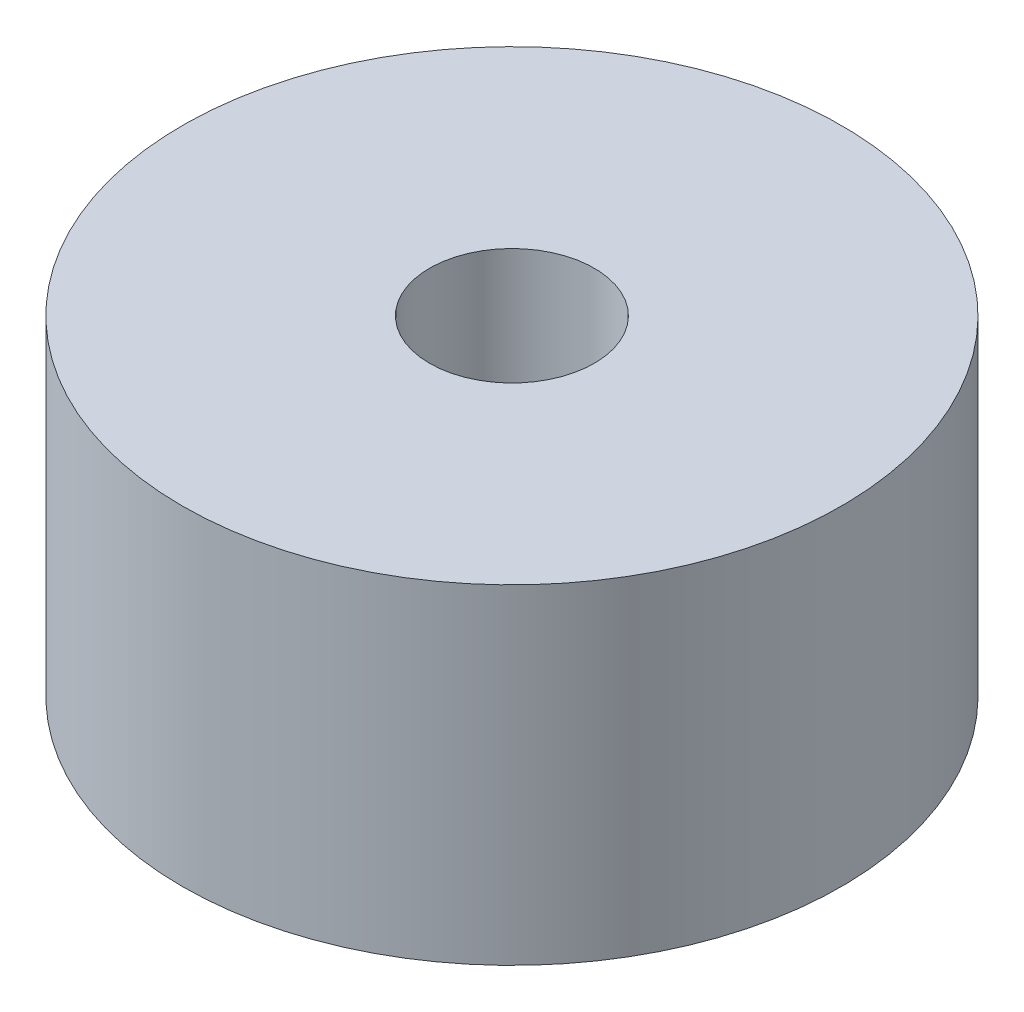
ISO-10303-21;
HEADER;
FILE_DESCRIPTION(('STEP AP214'),'2;1');
FILE_NAME('part.step','',(''),(''),'','','');
FILE_SCHEMA(('AUTOMOTIVE_DESIGN { 1 0 10303 214 1 1 1 1 }'));
ENDSEC;
DATA;
#1=APPLICATION_CONTEXT('core data for automotive mechanical design processes');
#2=APPLICATION_PROTOCOL_DEFINITION('international standard','automotive_design',2000,#1);
#3=PRODUCT_CONTEXT('',#1,'mechanical');
#4=PRODUCT('Part','Part','',(#3));
#5=PRODUCT_RELATED_PRODUCT_CATEGORY('part','',(#4));
#6=PRODUCT_DEFINITION_FORMATION('','',#4);
#7=PRODUCT_DEFINITION_CONTEXT('part definition',#1,'design');
#8=PRODUCT_DEFINITION('design','',#6,#7);
#9=PRODUCT_DEFINITION_SHAPE('','',#8);
#10=(LENGTH_UNIT() NAMED_UNIT(*) SI_UNIT(.MILLI.,.METRE.));
#11=(NAMED_UNIT(*) PLANE_ANGLE_UNIT() SI_UNIT($,.RADIAN.));
#12=(NAMED_UNIT(*) SI_UNIT($,.STERADIAN.) SOLID_ANGLE_UNIT());
#13=UNCERTAINTY_MEASURE_WITH_UNIT(LENGTH_MEASURE(1.E-05),#10,'distance_accuracy_value','');
#14=(GEOMETRIC_REPRESENTATION_CONTEXT(3) GLOBAL_UNCERTAINTY_ASSIGNED_CONTEXT((#13)) GLOBAL_UNIT_ASSIGNED_CONTEXT((#10,
#11,#12)) REPRESENTATION_CONTEXT('',''));
#15=CARTESIAN_POINT('',(0.,0.,0.));
#16=DIRECTION('',(0.,0.,1.));
#17=DIRECTION('',(1.,0.,0.));
#18=AXIS2_PLACEMENT_3D('',#15,#16,#17);
#19=CARTESIAN_POINT('',(0.,6.35,44.45));
#20=DIRECTION('',(0.,-1.,0.));
#21=DIRECTION('',(0.,0.,-1.));
#22=AXIS2_PLACEMENT_3D('',#19,#20,#21);
#23=CYLINDRICAL_SURFACE('',#22,3.175);
#24=DIRECTION('',(0.,1.,0.));
#25=VECTOR('',#24,1.);
#26=CARTESIAN_POINT('',(6.5404174179879E-13,3.81,47.625));
#27=LINE('',#26,#25);
#28=CARTESIAN_POINT('',(6.5404174179879E-13,3.81,47.625));
#29=VERTEX_POINT('',#28);
#30=CARTESIAN_POINT('',(6.5404174179879E-13,6.35,47.625));
#31=VERTEX_POINT('',#30);
#32=EDGE_CURVE('E313',#29,#31,#27,.T.);
#33=ORIENTED_EDGE('',*,*,#32,.F.);
#34=CARTESIAN_POINT('',(6.20785382046309E-13,3.81,44.45));
#35=DIRECTION('',(0.,1.,0.));
#36=DIRECTION('',(1.,0.,0.));
#37=AXIS2_PLACEMENT_3D('',#34,#35,#36);
#38=CIRCLE('',#37,3.175);
#39=CARTESIAN_POINT('',(2.90993556629759,3.81,45.72));
#40=VERTEX_POINT('',#39);
#41=EDGE_CURVE('E320',#29,#40,#38,.T.);
#42=ORIENTED_EDGE('',*,*,#41,.T.);
#43=DIRECTION('',(0.,-1.,0.));
#44=VECTOR('',#43,1.);
#45=CARTESIAN_POINT('',(2.90993556629759,6.35,45.72));
#46=LINE('',#45,#44);
#47=CARTESIAN_POINT('',(2.90993556629759,0.,45.72));
#48=VERTEX_POINT('',#47);
#49=EDGE_CURVE('E136',#40,#48,#46,.T.);
#50=ORIENTED_EDGE('',*,*,#49,.T.);
#51=CARTESIAN_POINT('',(0.,0.,44.45));
#52=DIRECTION('',(0.,-1.,0.));
#53=DIRECTION('',(0.,0.,-1.));
#54=AXIS2_PLACEMENT_3D('',#51,#52,#53);
#55=CIRCLE('',#54,3.175);
#56=CARTESIAN_POINT('',(2.90993556629756,0.,43.18));
#57=VERTEX_POINT('',#56);
#58=EDGE_CURVE('E117',#48,#57,#55,.T.);
#59=ORIENTED_EDGE('',*,*,#58,.T.);
#60=DIRECTION('',(0.,-1.,0.));
#61=VECTOR('',#60,1.);
#62=CARTESIAN_POINT('',(2.90993556629756,6.35,43.18));
#63=LINE('',#62,#61);
#64=CARTESIAN_POINT('',(2.90993556629756,6.35,43.18));
#65=VERTEX_POINT('',#64);
#66=EDGE_CURVE('E132',#65,#57,#63,.T.);
#67=ORIENTED_EDGE('',*,*,#66,.F.);
#68=CARTESIAN_POINT('',(0.,6.35,44.45));
#69=DIRECTION('',(0.,-1.,0.));
#70=DIRECTION('',(0.,0.,-1.));
#71=AXIS2_PLACEMENT_3D('',#68,#69,#70);
#72=CIRCLE('',#71,3.175);
#73=EDGE_CURVE('E119',#31,#65,#72,.T.);
#74=ORIENTED_EDGE('',*,*,#73,.F.);
#75=EDGE_LOOP('',(#33,#42,#50,#59,#67,#74));
#76=FACE_BOUND('',#75,.T.);
#77=ADVANCED_FACE('F32',(#76),#23,.F.);
#78=CARTESIAN_POINT('',(-44.45,6.35,4.65589036534732E-13));
#79=DIRECTION('',(0.,-1.,0.));
#80=DIRECTION('',(0.,0.,-1.));
#81=AXIS2_PLACEMENT_3D('',#78,#79,#80);
#82=CYLINDRICAL_SURFACE('',#81,3.175);
#83=DIRECTION('',(0.,1.,0.));
#84=VECTOR('',#83,1.);
#85=CARTESIAN_POINT('',(-47.625,3.81,1.55196345511577E-13));
#86=LINE('',#85,#84);
#87=CARTESIAN_POINT('',(-47.625,3.81,1.55196345511577E-13));
#88=VERTEX_POINT('',#87);
#89=CARTESIAN_POINT('',(-47.625,6.35,1.55196345511577E-13));
#90=VERTEX_POINT('',#89);
#91=EDGE_CURVE('E333',#88,#90,#86,.T.);
#92=ORIENTED_EDGE('',*,*,#91,.F.);
#93=CARTESIAN_POINT('',(-44.45,3.81,1.55196345511577E-13));
#94=DIRECTION('',(0.,1.,0.));
#95=DIRECTION('',(0.,0.,1.));
#96=AXIS2_PLACEMENT_3D('',#93,#94,#95);
#97=CIRCLE('',#96,3.175);
#98=CARTESIAN_POINT('',(-45.72,3.81,2.90993556629711));
#99=VERTEX_POINT('',#98);
#100=EDGE_CURVE('E339',#88,#99,#97,.T.);
#101=ORIENTED_EDGE('',*,*,#100,.T.);
#102=DIRECTION('',(0.,-1.,0.));
#103=VECTOR('',#102,1.);
#104=CARTESIAN_POINT('',(-45.72,6.35,2.90993556629711));
#105=LINE('',#104,#103);
#106=CARTESIAN_POINT('',(-45.72,0.,2.90993556629711));
#107=VERTEX_POINT('',#106);
#108=EDGE_CURVE('E266',#99,#107,#105,.T.);
#109=ORIENTED_EDGE('',*,*,#108,.T.);
#110=CARTESIAN_POINT('',(-44.45,0.,4.65589036534732E-13));
#111=DIRECTION('',(0.,-1.,0.));
#112=DIRECTION('',(1.,0.,0.));
#113=AXIS2_PLACEMENT_3D('',#110,#111,#112);
#114=CIRCLE('',#113,3.175);
#115=CARTESIAN_POINT('',(-43.18,0.,2.90993556629711));
#116=VERTEX_POINT('',#115);
#117=EDGE_CURVE('E77',#107,#116,#114,.T.);
#118=ORIENTED_EDGE('',*,*,#117,.T.);
#119=DIRECTION('',(0.,-1.,0.));
#120=VECTOR('',#119,1.);
#121=CARTESIAN_POINT('',(-43.18,6.35,2.90993556629711));
#122=LINE('',#121,#120);
#123=CARTESIAN_POINT('',(-43.18,6.35,2.90993556629711));
#124=VERTEX_POINT('',#123);
#125=EDGE_CURVE('E270',#124,#116,#122,.T.);
#126=ORIENTED_EDGE('',*,*,#125,.F.);
#127=CARTESIAN_POINT('',(-44.45,6.35,4.65589036534732E-13));
#128=DIRECTION('',(0.,-1.,0.));
#129=DIRECTION('',(1.,0.,0.));
#130=AXIS2_PLACEMENT_3D('',#127,#128,#129);
#131=CIRCLE('',#130,3.175);
#132=EDGE_CURVE('E110',#90,#124,#131,.T.);
#133=ORIENTED_EDGE('',*,*,#132,.F.);
#134=EDGE_LOOP('',(#92,#101,#109,#118,#126,#133));
#135=FACE_BOUND('',#134,.T.);
#136=ADVANCED_FACE('F383',(#135),#82,.F.);
#137=CARTESIAN_POINT('',(0.,6.35,-44.45));
#138=DIRECTION('',(0.,-1.,0.));
#139=DIRECTION('',(0.,0.,-1.));
#140=AXIS2_PLACEMENT_3D('',#137,#138,#139);
#141=CYLINDRICAL_SURFACE('',#140,3.175);
#142=DIRECTION('',(0.,1.,0.));
#143=VECTOR('',#142,1.);
#144=CARTESIAN_POINT('',(-3.21478144273981E-13,3.81,-47.625));
#145=LINE('',#144,#143);
#146=CARTESIAN_POINT('',(-3.21478144273981E-13,3.81,-47.625));
#147=VERTEX_POINT('',#146);
#148=CARTESIAN_POINT('',(-3.21478144273981E-13,6.35,-47.625));
#149=VERTEX_POINT('',#148);
#150=EDGE_CURVE('E290',#147,#149,#145,.T.);
#151=ORIENTED_EDGE('',*,*,#150,.F.);
#152=CARTESIAN_POINT('',(-3.10392691023154E-13,3.81,-44.45));
#153=DIRECTION('',(0.,1.,0.));
#154=DIRECTION('',(-1.,0.,0.));
#155=AXIS2_PLACEMENT_3D('',#152,#153,#154);
#156=CIRCLE('',#155,3.175);
#157=CARTESIAN_POINT('',(-2.90993556629727,3.81,-45.72));
#158=VERTEX_POINT('',#157);
#159=EDGE_CURVE('E297',#147,#158,#156,.T.);
#160=ORIENTED_EDGE('',*,*,#159,.T.);
#161=DIRECTION('',(0.,-1.,0.));
#162=VECTOR('',#161,1.);
#163=CARTESIAN_POINT('',(-2.90993556629727,6.35,-45.72));
#164=LINE('',#163,#162);
#165=CARTESIAN_POINT('',(-2.90993556629727,0.,-45.72));
#166=VERTEX_POINT('',#165);
#167=EDGE_CURVE('E223',#158,#166,#164,.T.);
#168=ORIENTED_EDGE('',*,*,#167,.T.);
#169=CARTESIAN_POINT('',(0.,0.,-44.45));
#170=DIRECTION('',(0.,-1.,0.));
#171=DIRECTION('',(0.,0.,1.));
#172=AXIS2_PLACEMENT_3D('',#169,#170,#171);
#173=CIRCLE('',#172,3.175);
#174=CARTESIAN_POINT('',(-2.90993556629726,0.,-43.18));
#175=VERTEX_POINT('',#174);
#176=EDGE_CURVE('E107',#166,#175,#173,.T.);
#177=ORIENTED_EDGE('',*,*,#176,.T.);
#178=DIRECTION('',(0.,-1.,0.));
#179=VECTOR('',#178,1.);
#180=CARTESIAN_POINT('',(-2.90993556629726,6.35,-43.18));
#181=LINE('',#180,#179);
#182=CARTESIAN_POINT('',(-2.90993556629726,6.35,-43.18));
#183=VERTEX_POINT('',#182);
#184=EDGE_CURVE('E226',#183,#175,#181,.T.);
#185=ORIENTED_EDGE('',*,*,#184,.F.);
#186=CARTESIAN_POINT('',(0.,6.35,-44.45));
#187=DIRECTION('',(0.,-1.,0.));
#188=DIRECTION('',(0.,0.,1.));
#189=AXIS2_PLACEMENT_3D('',#186,#187,#188);
#190=CIRCLE('',#189,3.175);
#191=EDGE_CURVE('E103',#149,#183,#190,.T.);
#192=ORIENTED_EDGE('',*,*,#191,.F.);
#193=EDGE_LOOP('',(#151,#160,#168,#177,#185,#192));
#194=FACE_BOUND('',#193,.T.);
#195=ADVANCED_FACE('F388',(#194),#141,.F.);
#196=CARTESIAN_POINT('',(44.45,6.35,-1.55196345511577E-13));
#197=DIRECTION('',(0.,-1.,0.));
#198=DIRECTION('',(0.,0.,-1.));
#199=AXIS2_PLACEMENT_3D('',#196,#197,#198);
#200=CYLINDRICAL_SURFACE('',#199,3.175);
#201=DIRECTION('',(0.,1.,0.));
#202=VECTOR('',#201,1.);
#203=CARTESIAN_POINT('',(47.625,3.81,-1.55196345511577E-13));
#204=LINE('',#203,#202);
#205=CARTESIAN_POINT('',(47.625,3.81,-1.55196345511577E-13));
#206=VERTEX_POINT('',#205);
#207=CARTESIAN_POINT('',(47.625,6.35,-1.55196345511577E-13));
#208=VERTEX_POINT('',#207);
#209=EDGE_CURVE('E92',#206,#208,#204,.T.);
#210=ORIENTED_EDGE('',*,*,#209,.F.);
#211=CARTESIAN_POINT('',(44.45,3.81,-1.55196345511577E-13));
#212=DIRECTION('',(0.,1.,0.));
#213=DIRECTION('',(0.,0.,-1.));
#214=AXIS2_PLACEMENT_3D('',#211,#212,#213);
#215=CIRCLE('',#214,3.175);
#216=CARTESIAN_POINT('',(45.72,3.81,-2.90993556629711));
#217=VERTEX_POINT('',#216);
#218=EDGE_CURVE('E196',#206,#217,#215,.T.);
#219=ORIENTED_EDGE('',*,*,#218,.T.);
#220=DIRECTION('',(0.,-1.,0.));
#221=VECTOR('',#220,1.);
#222=CARTESIAN_POINT('',(45.72,6.35,-2.90993556629711));
#223=LINE('',#222,#221);
#224=CARTESIAN_POINT('',(45.72,0.,-2.90993556629711));
#225=VERTEX_POINT('',#224);
#226=EDGE_CURVE('E99',#217,#225,#223,.T.);
#227=ORIENTED_EDGE('',*,*,#226,.T.);
#228=CARTESIAN_POINT('',(44.45,0.,-1.55196345511577E-13));
#229=DIRECTION('',(0.,-1.,0.));
#230=DIRECTION('',(-1.,0.,0.));
#231=AXIS2_PLACEMENT_3D('',#228,#229,#230);
#232=CIRCLE('',#231,3.175);
#233=CARTESIAN_POINT('',(43.18,0.,-2.90993556629711));
#234=VERTEX_POINT('',#233);
#235=EDGE_CURVE('E106',#225,#234,#232,.T.);
#236=ORIENTED_EDGE('',*,*,#235,.T.);
#237=DIRECTION('',(0.,-1.,0.));
#238=VECTOR('',#237,1.);
#239=CARTESIAN_POINT('',(43.18,6.35,-2.90993556629711));
#240=LINE('',#239,#238);
#241=CARTESIAN_POINT('',(43.18,6.35,-2.90993556629711));
#242=VERTEX_POINT('',#241);
#243=EDGE_CURVE('E64',#242,#234,#240,.T.);
#244=ORIENTED_EDGE('',*,*,#243,.F.);
#245=CARTESIAN_POINT('',(44.45,6.35,-1.55196345511577E-13));
#246=DIRECTION('',(0.,-1.,0.));
#247=DIRECTION('',(-1.,0.,0.));
#248=AXIS2_PLACEMENT_3D('',#245,#246,#247);
#249=CIRCLE('',#248,3.175);
#250=EDGE_CURVE('E115',#208,#242,#249,.T.);
#251=ORIENTED_EDGE('',*,*,#250,.F.);
#252=EDGE_LOOP('',(#210,#219,#227,#236,#244,#251));
#253=FACE_BOUND('',#252,.T.);
#254=ADVANCED_FACE('F207',(#253),#200,.F.);
#255=CARTESIAN_POINT('',(0.,50.8,0.));
#256=DIRECTION('',(0.,-1.,0.));
#257=DIRECTION('',(0.,0.,-1.));
#258=AXIS2_PLACEMENT_3D('',#255,#256,#257);
#259=CYLINDRICAL_SURFACE('',#258,50.8);
#260=CARTESIAN_POINT('',(0.,50.8,0.));
#261=DIRECTION('',(0.,1.,0.));
#262=DIRECTION('',(0.,0.,1.));
#263=AXIS2_PLACEMENT_3D('',#260,#261,#262);
#264=CIRCLE('',#263,50.8);
#265=CARTESIAN_POINT('',(0.,50.8,50.8));
#266=VERTEX_POINT('',#265);
#267=EDGE_CURVE('E11',#266,#266,#264,.T.);
#268=ORIENTED_EDGE('',*,*,#267,.F.);
#269=EDGE_LOOP('',(#268));
#270=FACE_BOUND('',#269,.T.);
#271=CARTESIAN_POINT('',(0.,0.,0.));
#272=DIRECTION('',(0.,1.,0.));
#273=DIRECTION('',(0.,0.,1.));
#274=AXIS2_PLACEMENT_3D('',#271,#272,#273);
#275=CIRCLE('',#274,50.8);
#276=CARTESIAN_POINT('',(0.,0.,50.8));
#277=VERTEX_POINT('',#276);
#278=EDGE_CURVE('E36',#277,#277,#275,.T.);
#279=ORIENTED_EDGE('',*,*,#278,.T.);
#280=EDGE_LOOP('',(#279));
#281=FACE_BOUND('',#280,.T.);
#282=ADVANCED_FACE('F34',(#270,#281),#259,.T.);
#283=CARTESIAN_POINT('',(0.,50.8,0.));
#284=DIRECTION('',(0.,1.,0.));
#285=DIRECTION('',(0.,0.,1.));
#286=AXIS2_PLACEMENT_3D('',#283,#284,#285);
#287=PLANE('',#286);
#288=CARTESIAN_POINT('',(0.,50.8,0.));
#289=DIRECTION('',(0.,1.,0.));
#290=DIRECTION('',(0.,0.,1.));
#291=AXIS2_PLACEMENT_3D('',#288,#289,#290);
#292=CIRCLE('',#291,12.7);
#293=CARTESIAN_POINT('',(0.,50.8,12.7));
#294=VERTEX_POINT('',#293);
#295=EDGE_CURVE('E350',#294,#294,#292,.T.);
#296=ORIENTED_EDGE('',*,*,#295,.F.);
#297=EDGE_LOOP('',(#296));
#298=FACE_BOUND('',#297,.T.);
#299=ORIENTED_EDGE('',*,*,#267,.T.);
#300=EDGE_LOOP('',(#299));
#301=FACE_BOUND('',#300,.T.);
#302=ADVANCED_FACE('F365',(#298,#301),#287,.T.);
#303=CARTESIAN_POINT('',(0.,0.,0.));
#304=DIRECTION('',(0.,1.,0.));
#305=DIRECTION('',(0.,0.,1.));
#306=AXIS2_PLACEMENT_3D('',#303,#304,#305);
#307=PLANE('',#306);
#308=CARTESIAN_POINT('',(0.,0.,0.));
#309=DIRECTION('',(0.,1.,0.));
#310=DIRECTION('',(0.,0.,1.));
#311=AXIS2_PLACEMENT_3D('',#308,#309,#310);
#312=CIRCLE('',#311,12.7);
#313=CARTESIAN_POINT('',(0.,0.,12.7));
#314=VERTEX_POINT('',#313);
#315=EDGE_CURVE('E321',#314,#314,#312,.T.);
#316=ORIENTED_EDGE('',*,*,#315,.T.);
#317=EDGE_LOOP('',(#316));
#318=FACE_BOUND('',#317,.T.);
#319=CARTESIAN_POINT('',(-3.10392691023154E-13,0.,-44.45));
#320=DIRECTION('',(0.,-1.,0.));
#321=DIRECTION('',(-1.,0.,0.));
#322=AXIS2_PLACEMENT_3D('',#319,#320,#321);
#323=CIRCLE('',#322,4.89861936147405);
#324=CARTESIAN_POINT('',(-4.73112794675977,0.,-43.18));
#325=VERTEX_POINT('',#324);
#326=CARTESIAN_POINT('',(-4.73112794675978,0.,-45.72));
#327=VERTEX_POINT('',#326);
#328=EDGE_CURVE('E236',#325,#327,#323,.T.);
#329=ORIENTED_EDGE('',*,*,#328,.F.);
#330=DIRECTION('',(-1.,0.,0.));
#331=VECTOR('',#330,1.);
#332=CARTESIAN_POINT('',(-4.73112794675977,0.,-43.18));
#333=LINE('',#332,#331);
#334=EDGE_CURVE('E229',#175,#325,#333,.T.);
#335=ORIENTED_EDGE('',*,*,#334,.F.);
#336=ORIENTED_EDGE('',*,*,#176,.F.);
#337=DIRECTION('',(1.,0.,0.));
#338=VECTOR('',#337,1.);
#339=CARTESIAN_POINT('',(-4.73112794675978,0.,-45.72));
#340=LINE('',#339,#338);
#341=EDGE_CURVE('E233',#327,#166,#340,.T.);
#342=ORIENTED_EDGE('',*,*,#341,.F.);
#343=EDGE_LOOP('',(#329,#335,#336,#342));
#344=FACE_BOUND('',#343,.T.);
#345=CARTESIAN_POINT('',(-44.45,0.,1.55196345511577E-13));
#346=DIRECTION('',(0.,-1.,0.));
#347=DIRECTION('',(0.,0.,1.));
#348=AXIS2_PLACEMENT_3D('',#345,#346,#347);
#349=CIRCLE('',#348,4.89861936147405);
#350=CARTESIAN_POINT('',(-43.18,0.,4.73112794675962));
#351=VERTEX_POINT('',#350);
#352=CARTESIAN_POINT('',(-45.72,0.,4.73112794675962));
#353=VERTEX_POINT('',#352);
#354=EDGE_CURVE('E251',#351,#353,#349,.T.);
#355=ORIENTED_EDGE('',*,*,#354,.F.);
#356=DIRECTION('',(0.,0.,1.));
#357=VECTOR('',#356,1.);
#358=CARTESIAN_POINT('',(-43.18,0.,4.73112794675962));
#359=LINE('',#358,#357);
#360=EDGE_CURVE('E275',#116,#351,#359,.T.);
#361=ORIENTED_EDGE('',*,*,#360,.F.);
#362=ORIENTED_EDGE('',*,*,#117,.F.);
#363=DIRECTION('',(0.,0.,-1.));
#364=VECTOR('',#363,1.);
#365=CARTESIAN_POINT('',(-45.72,0.,4.73112794675962));
#366=LINE('',#365,#364);
#367=EDGE_CURVE('E279',#353,#107,#366,.T.);
#368=ORIENTED_EDGE('',*,*,#367,.F.);
#369=EDGE_LOOP('',(#355,#361,#362,#368));
#370=FACE_BOUND('',#369,.T.);
#371=CARTESIAN_POINT('',(44.45,0.,-1.55196345511577E-13));
#372=DIRECTION('',(0.,-1.,0.));
#373=DIRECTION('',(0.,0.,-1.));
#374=AXIS2_PLACEMENT_3D('',#371,#372,#373);
#375=CIRCLE('',#374,4.89861936147405);
#376=CARTESIAN_POINT('',(43.18,0.,-4.73112794675962));
#377=VERTEX_POINT('',#376);
#378=CARTESIAN_POINT('',(45.72,0.,-4.73112794675962));
#379=VERTEX_POINT('',#378);
#380=EDGE_CURVE('E71',#377,#379,#375,.T.);
#381=ORIENTED_EDGE('',*,*,#380,.F.);
#382=DIRECTION('',(0.,0.,-1.));
#383=VECTOR('',#382,1.);
#384=CARTESIAN_POINT('',(43.18,0.,-4.73112794675962));
#385=LINE('',#384,#383);
#386=EDGE_CURVE('E79',#234,#377,#385,.T.);
#387=ORIENTED_EDGE('',*,*,#386,.F.);
#388=ORIENTED_EDGE('',*,*,#235,.F.);
#389=DIRECTION('',(0.,0.,1.));
#390=VECTOR('',#389,1.);
#391=CARTESIAN_POINT('',(45.72,0.,-4.73112794675962));
#392=LINE('',#391,#390);
#393=EDGE_CURVE('E84',#379,#225,#392,.T.);
#394=ORIENTED_EDGE('',*,*,#393,.F.);
#395=EDGE_LOOP('',(#381,#387,#388,#394));
#396=FACE_BOUND('',#395,.T.);
#397=CARTESIAN_POINT('',(6.20785382046309E-13,0.,44.45));
#398=DIRECTION('',(0.,-1.,0.));
#399=DIRECTION('',(1.,0.,0.));
#400=AXIS2_PLACEMENT_3D('',#397,#398,#399);
#401=CIRCLE('',#400,4.89861936147405);
#402=CARTESIAN_POINT('',(4.73112794676007,0.,43.1799999999999));
#403=VERTEX_POINT('',#402);
#404=CARTESIAN_POINT('',(4.7311279467601,0.,45.7199999999999));
#405=VERTEX_POINT('',#404);
#406=EDGE_CURVE('E255',#403,#405,#401,.T.);
#407=ORIENTED_EDGE('',*,*,#406,.F.);
#408=DIRECTION('',(1.,0.,0.));
#409=VECTOR('',#408,1.);
#410=CARTESIAN_POINT('',(4.73112794676007,0.,43.1799999999999));
#411=LINE('',#410,#409);
#412=EDGE_CURVE('E147',#57,#403,#411,.T.);
#413=ORIENTED_EDGE('',*,*,#412,.F.);
#414=ORIENTED_EDGE('',*,*,#58,.F.);
#415=DIRECTION('',(-1.,0.,0.));
#416=VECTOR('',#415,1.);
#417=CARTESIAN_POINT('',(4.7311279467601,0.,45.7199999999999));
#418=LINE('',#417,#416);
#419=EDGE_CURVE('E145',#405,#48,#418,.T.);
#420=ORIENTED_EDGE('',*,*,#419,.F.);
#421=EDGE_LOOP('',(#407,#413,#414,#420));
#422=FACE_BOUND('',#421,.T.);
#423=ORIENTED_EDGE('',*,*,#278,.F.);
#424=EDGE_LOOP('',(#423));
#425=FACE_BOUND('',#424,.T.);
#426=ADVANCED_FACE('F86',(#318,#344,#370,#396,#422,#425),#307,.F.);
#427=CARTESIAN_POINT('',(0.,6.35,44.45));
#428=DIRECTION('',(0.,-1.,0.));
#429=DIRECTION('',(0.,0.,-1.));
#430=AXIS2_PLACEMENT_3D('',#427,#428,#429);
#431=PLANE('',#430);
#432=DIRECTION('',(0.,0.,-1.));
#433=VECTOR('',#432,1.);
#434=CARTESIAN_POINT('',(6.5404174179879E-13,6.35,47.625));
#435=LINE('',#434,#433);
#436=CARTESIAN_POINT('',(6.72095696306356E-13,6.35,49.348619361474));
#437=VERTEX_POINT('',#436);
#438=EDGE_CURVE('E317',#437,#31,#435,.T.);
#439=ORIENTED_EDGE('',*,*,#438,.T.);
#440=ORIENTED_EDGE('',*,*,#73,.T.);
#441=DIRECTION('',(1.,0.,0.));
#442=VECTOR('',#441,1.);
#443=CARTESIAN_POINT('',(4.73112794676007,6.35,43.1799999999999));
#444=LINE('',#443,#442);
#445=CARTESIAN_POINT('',(4.73112794676007,6.35,43.1799999999999));
#446=VERTEX_POINT('',#445);
#447=EDGE_CURVE('E246',#65,#446,#444,.T.);
#448=ORIENTED_EDGE('',*,*,#447,.T.);
#449=CARTESIAN_POINT('',(6.20785382046309E-13,6.35,44.45));
#450=DIRECTION('',(0.,-1.,0.));
#451=DIRECTION('',(1.,0.,0.));
#452=AXIS2_PLACEMENT_3D('',#449,#450,#451);
#453=CIRCLE('',#452,4.89861936147405);
#454=EDGE_CURVE('E253',#446,#437,#453,.T.);
#455=ORIENTED_EDGE('',*,*,#454,.T.);
#456=EDGE_LOOP('',(#439,#440,#448,#455));
#457=FACE_BOUND('',#456,.T.);
#458=ADVANCED_FACE('F376',(#457),#431,.T.);
#459=CARTESIAN_POINT('',(44.45,6.35,-1.55196345511577E-13));
#460=DIRECTION('',(0.,-1.,0.));
#461=DIRECTION('',(-1.,0.,0.));
#462=AXIS2_PLACEMENT_3D('',#459,#460,#461);
#463=PLANE('',#462);
#464=DIRECTION('',(-1.,0.,0.));
#465=VECTOR('',#464,1.);
#466=CARTESIAN_POINT('',(47.625,6.35,-1.55196345511577E-13));
#467=LINE('',#466,#465);
#468=CARTESIAN_POINT('',(49.348619361474,6.35,-1.55196345511577E-13));
#469=VERTEX_POINT('',#468);
#470=EDGE_CURVE('E190',#469,#208,#467,.T.);
#471=ORIENTED_EDGE('',*,*,#470,.T.);
#472=ORIENTED_EDGE('',*,*,#250,.T.);
#473=DIRECTION('',(0.,0.,-1.));
#474=VECTOR('',#473,1.);
#475=CARTESIAN_POINT('',(43.18,6.35,-4.73112794675962));
#476=LINE('',#475,#474);
#477=CARTESIAN_POINT('',(43.18,6.35,-4.73112794675962));
#478=VERTEX_POINT('',#477);
#479=EDGE_CURVE('E95',#242,#478,#476,.T.);
#480=ORIENTED_EDGE('',*,*,#479,.T.);
#481=CARTESIAN_POINT('',(44.45,6.35,-1.55196345511577E-13));
#482=DIRECTION('',(0.,-1.,0.));
#483=DIRECTION('',(0.,0.,-1.));
#484=AXIS2_PLACEMENT_3D('',#481,#482,#483);
#485=CIRCLE('',#484,4.89861936147405);
#486=EDGE_CURVE('E75',#478,#469,#485,.T.);
#487=ORIENTED_EDGE('',*,*,#486,.T.);
#488=EDGE_LOOP('',(#471,#472,#480,#487));
#489=FACE_BOUND('',#488,.T.);
#490=ADVANCED_FACE('F192',(#489),#463,.T.);
#491=CARTESIAN_POINT('',(-44.45,6.35,4.65589036534732E-13));
#492=DIRECTION('',(0.,-1.,0.));
#493=DIRECTION('',(1.,0.,0.));
#494=AXIS2_PLACEMENT_3D('',#491,#492,#493);
#495=PLANE('',#494);
#496=DIRECTION('',(1.,0.,0.));
#497=VECTOR('',#496,1.);
#498=CARTESIAN_POINT('',(-47.625,6.35,1.55196345511577E-13));
#499=LINE('',#498,#497);
#500=CARTESIAN_POINT('',(-49.348619361474,6.35,1.55196345511577E-13));
#501=VERTEX_POINT('',#500);
#502=EDGE_CURVE('E312',#501,#90,#499,.T.);
#503=ORIENTED_EDGE('',*,*,#502,.T.);
#504=ORIENTED_EDGE('',*,*,#132,.T.);
#505=DIRECTION('',(0.,0.,1.));
#506=VECTOR('',#505,1.);
#507=CARTESIAN_POINT('',(-43.18,6.35,4.73112794675962));
#508=LINE('',#507,#506);
#509=CARTESIAN_POINT('',(-43.18,6.35,4.73112794675962));
#510=VERTEX_POINT('',#509);
#511=EDGE_CURVE('E267',#124,#510,#508,.T.);
#512=ORIENTED_EDGE('',*,*,#511,.T.);
#513=CARTESIAN_POINT('',(-44.45,6.35,1.55196345511577E-13));
#514=DIRECTION('',(0.,-1.,0.));
#515=DIRECTION('',(0.,0.,1.));
#516=AXIS2_PLACEMENT_3D('',#513,#514,#515);
#517=CIRCLE('',#516,4.89861936147405);
#518=EDGE_CURVE('E278',#510,#501,#517,.T.);
#519=ORIENTED_EDGE('',*,*,#518,.T.);
#520=EDGE_LOOP('',(#503,#504,#512,#519));
#521=FACE_BOUND('',#520,.T.);
#522=ADVANCED_FACE('F395',(#521),#495,.T.);
#523=CARTESIAN_POINT('',(0.,6.35,-44.45));
#524=DIRECTION('',(0.,-1.,0.));
#525=DIRECTION('',(0.,0.,1.));
#526=AXIS2_PLACEMENT_3D('',#523,#524,#525);
#527=PLANE('',#526);
#528=DIRECTION('',(0.,0.,1.));
#529=VECTOR('',#528,1.);
#530=CARTESIAN_POINT('',(-3.21478144273981E-13,6.35,-47.625));
#531=LINE('',#530,#529);
#532=CARTESIAN_POINT('',(-3.27496129109837E-13,6.35,-49.348619361474));
#533=VERTEX_POINT('',#532);
#534=EDGE_CURVE('E294',#533,#149,#531,.T.);
#535=ORIENTED_EDGE('',*,*,#534,.T.);
#536=ORIENTED_EDGE('',*,*,#191,.T.);
#537=DIRECTION('',(-1.,0.,0.));
#538=VECTOR('',#537,1.);
#539=CARTESIAN_POINT('',(-4.73112794675977,6.35,-43.18));
#540=LINE('',#539,#538);
#541=CARTESIAN_POINT('',(-4.73112794675977,6.35,-43.18));
#542=VERTEX_POINT('',#541);
#543=EDGE_CURVE('E224',#183,#542,#540,.T.);
#544=ORIENTED_EDGE('',*,*,#543,.T.);
#545=CARTESIAN_POINT('',(-3.10392691023154E-13,6.35,-44.45));
#546=DIRECTION('',(0.,-1.,0.));
#547=DIRECTION('',(-1.,0.,0.));
#548=AXIS2_PLACEMENT_3D('',#545,#546,#547);
#549=CIRCLE('',#548,4.89861936147405);
#550=EDGE_CURVE('E232',#542,#533,#549,.T.);
#551=ORIENTED_EDGE('',*,*,#550,.T.);
#552=EDGE_LOOP('',(#535,#536,#544,#551));
#553=FACE_BOUND('',#552,.T.);
#554=ADVANCED_FACE('F399',(#553),#527,.T.);
#555=CARTESIAN_POINT('',(44.45,6.35,-1.55196345511577E-13));
#556=DIRECTION('',(0.,-1.,0.));
#557=DIRECTION('',(0.,0.,-1.));
#558=AXIS2_PLACEMENT_3D('',#555,#556,#557);
#559=CYLINDRICAL_SURFACE('',#558,4.89861936147405);
#560=ORIENTED_EDGE('',*,*,#380,.T.);
#561=DIRECTION('',(0.,-1.,0.));
#562=VECTOR('',#561,1.);
#563=CARTESIAN_POINT('',(45.72,6.35,-4.73112794675962));
#564=LINE('',#563,#562);
#565=CARTESIAN_POINT('',(45.72,3.81,-4.73112794675962));
#566=VERTEX_POINT('',#565);
#567=EDGE_CURVE('E101',#566,#379,#564,.T.);
#568=ORIENTED_EDGE('',*,*,#567,.F.);
#569=CARTESIAN_POINT('',(44.45,3.81,-1.55196345511577E-13));
#570=DIRECTION('',(0.,-1.,0.));
#571=DIRECTION('',(0.,0.,-1.));
#572=AXIS2_PLACEMENT_3D('',#569,#570,#571);
#573=CIRCLE('',#572,4.89861936147405);
#574=CARTESIAN_POINT('',(49.348619361474,3.81,-1.55196345511577E-13));
#575=VERTEX_POINT('',#574);
#576=EDGE_CURVE('E213',#566,#575,#573,.T.);
#577=ORIENTED_EDGE('',*,*,#576,.T.);
#578=DIRECTION('',(0.,1.,0.));
#579=VECTOR('',#578,1.);
#580=CARTESIAN_POINT('',(49.348619361474,3.81,-1.55196345511577E-13));
#581=LINE('',#580,#579);
#582=EDGE_CURVE('E89',#575,#469,#581,.T.);
#583=ORIENTED_EDGE('',*,*,#582,.T.);
#584=ORIENTED_EDGE('',*,*,#486,.F.);
#585=DIRECTION('',(0.,-1.,0.));
#586=VECTOR('',#585,1.);
#587=CARTESIAN_POINT('',(43.18,6.35,-4.73112794675962));
#588=LINE('',#587,#586);
#589=EDGE_CURVE('E49',#478,#377,#588,.T.);
#590=ORIENTED_EDGE('',*,*,#589,.T.);
#591=EDGE_LOOP('',(#560,#568,#577,#583,#584,#590));
#592=FACE_BOUND('',#591,.T.);
#593=ADVANCED_FACE('F68',(#592),#559,.F.);
#594=CARTESIAN_POINT('',(43.18,6.35,-4.73112794675962));
#595=DIRECTION('',(-1.,0.,0.));
#596=DIRECTION('',(0.,0.,1.));
#597=AXIS2_PLACEMENT_3D('',#594,#595,#596);
#598=PLANE('',#597);
#599=ORIENTED_EDGE('',*,*,#386,.T.);
#600=ORIENTED_EDGE('',*,*,#589,.F.);
#601=ORIENTED_EDGE('',*,*,#479,.F.);
#602=ORIENTED_EDGE('',*,*,#243,.T.);
#603=EDGE_LOOP('',(#599,#600,#601,#602));
#604=FACE_BOUND('',#603,.T.);
#605=ADVANCED_FACE('F80',(#604),#598,.F.);
#606=CARTESIAN_POINT('',(45.72,6.35,-4.73112794675962));
#607=DIRECTION('',(1.,0.,0.));
#608=DIRECTION('',(0.,0.,-1.));
#609=AXIS2_PLACEMENT_3D('',#606,#607,#608);
#610=PLANE('',#609);
#611=ORIENTED_EDGE('',*,*,#226,.F.);
#612=DIRECTION('',(0.,0.,-1.));
#613=VECTOR('',#612,1.);
#614=CARTESIAN_POINT('',(45.72,3.81,-4.73112794675962));
#615=LINE('',#614,#613);
#616=EDGE_CURVE('E212',#217,#566,#615,.T.);
#617=ORIENTED_EDGE('',*,*,#616,.T.);
#618=ORIENTED_EDGE('',*,*,#567,.T.);
#619=ORIENTED_EDGE('',*,*,#393,.T.);
#620=EDGE_LOOP('',(#611,#617,#618,#619));
#621=FACE_BOUND('',#620,.T.);
#622=ADVANCED_FACE('F211',(#621),#610,.F.);
#623=CARTESIAN_POINT('',(47.625,3.81,-1.55196345511577E-13));
#624=DIRECTION('',(0.,0.,-1.));
#625=DIRECTION('',(-1.,0.,0.));
#626=AXIS2_PLACEMENT_3D('',#623,#624,#625);
#627=PLANE('',#626);
#628=ORIENTED_EDGE('',*,*,#470,.F.);
#629=ORIENTED_EDGE('',*,*,#582,.F.);
#630=DIRECTION('',(-1.,0.,0.));
#631=VECTOR('',#630,1.);
#632=CARTESIAN_POINT('',(47.625,3.81,-1.55196345511577E-13));
#633=LINE('',#632,#631);
#634=EDGE_CURVE('E202',#575,#206,#633,.T.);
#635=ORIENTED_EDGE('',*,*,#634,.T.);
#636=ORIENTED_EDGE('',*,*,#209,.T.);
#637=EDGE_LOOP('',(#628,#629,#635,#636));
#638=FACE_BOUND('',#637,.T.);
#639=ADVANCED_FACE('F200',(#638),#627,.T.);
#640=CARTESIAN_POINT('',(44.45,3.81,-1.55196345511577E-13));
#641=DIRECTION('',(0.,-1.,0.));
#642=DIRECTION('',(0.,0.,-1.));
#643=AXIS2_PLACEMENT_3D('',#640,#641,#642);
#644=PLANE('',#643);
#645=ORIENTED_EDGE('',*,*,#218,.F.);
#646=ORIENTED_EDGE('',*,*,#634,.F.);
#647=ORIENTED_EDGE('',*,*,#576,.F.);
#648=ORIENTED_EDGE('',*,*,#616,.F.);
#649=EDGE_LOOP('',(#645,#646,#647,#648));
#650=FACE_BOUND('',#649,.T.);
#651=ADVANCED_FACE('F216',(#650),#644,.F.);
#652=CARTESIAN_POINT('',(-3.10392691023154E-13,6.35,-44.45));
#653=DIRECTION('',(0.,-1.,0.));
#654=DIRECTION('',(0.,0.,-1.));
#655=AXIS2_PLACEMENT_3D('',#652,#653,#654);
#656=CYLINDRICAL_SURFACE('',#655,4.89861936147405);
#657=ORIENTED_EDGE('',*,*,#328,.T.);
#658=DIRECTION('',(0.,-1.,0.));
#659=VECTOR('',#658,1.);
#660=CARTESIAN_POINT('',(-4.73112794675978,6.35,-45.72));
#661=LINE('',#660,#659);
#662=CARTESIAN_POINT('',(-4.73112794675978,3.81,-45.72));
#663=VERTEX_POINT('',#662);
#664=EDGE_CURVE('E221',#663,#327,#661,.T.);
#665=ORIENTED_EDGE('',*,*,#664,.F.);
#666=CARTESIAN_POINT('',(-3.10392691023154E-13,3.81,-44.45));
#667=DIRECTION('',(0.,-1.,0.));
#668=DIRECTION('',(-1.,0.,0.));
#669=AXIS2_PLACEMENT_3D('',#666,#667,#668);
#670=CIRCLE('',#669,4.89861936147405);
#671=CARTESIAN_POINT('',(-3.27496129109837E-13,3.81,-49.348619361474));
#672=VERTEX_POINT('',#671);
#673=EDGE_CURVE('E301',#663,#672,#670,.T.);
#674=ORIENTED_EDGE('',*,*,#673,.T.);
#675=DIRECTION('',(0.,1.,0.));
#676=VECTOR('',#675,1.);
#677=CARTESIAN_POINT('',(-3.27496129109837E-13,3.81,-49.348619361474));
#678=LINE('',#677,#676);
#679=EDGE_CURVE('E258',#672,#533,#678,.T.);
#680=ORIENTED_EDGE('',*,*,#679,.T.);
#681=ORIENTED_EDGE('',*,*,#550,.F.);
#682=DIRECTION('',(0.,-1.,0.));
#683=VECTOR('',#682,1.);
#684=CARTESIAN_POINT('',(-4.73112794675977,6.35,-43.18));
#685=LINE('',#684,#683);
#686=EDGE_CURVE('E197',#542,#325,#685,.T.);
#687=ORIENTED_EDGE('',*,*,#686,.T.);
#688=EDGE_LOOP('',(#657,#665,#674,#680,#681,#687));
#689=FACE_BOUND('',#688,.T.);
#690=ADVANCED_FACE('F417',(#689),#656,.F.);
#691=CARTESIAN_POINT('',(-4.73112794675977,6.35,-43.18));
#692=DIRECTION('',(0.,0.,1.));
#693=DIRECTION('',(1.,0.,0.));
#694=AXIS2_PLACEMENT_3D('',#691,#692,#693);
#695=PLANE('',#694);
#696=ORIENTED_EDGE('',*,*,#334,.T.);
#697=ORIENTED_EDGE('',*,*,#686,.F.);
#698=ORIENTED_EDGE('',*,*,#543,.F.);
#699=ORIENTED_EDGE('',*,*,#184,.T.);
#700=EDGE_LOOP('',(#696,#697,#698,#699));
#701=FACE_BOUND('',#700,.T.);
#702=ADVANCED_FACE('F420',(#701),#695,.F.);
#703=CARTESIAN_POINT('',(-4.73112794675978,6.35,-45.72));
#704=DIRECTION('',(0.,0.,-1.));
#705=DIRECTION('',(-1.,0.,0.));
#706=AXIS2_PLACEMENT_3D('',#703,#704,#705);
#707=PLANE('',#706);
#708=ORIENTED_EDGE('',*,*,#167,.F.);
#709=DIRECTION('',(-1.,0.,0.));
#710=VECTOR('',#709,1.);
#711=CARTESIAN_POINT('',(-4.73112794675978,3.81,-45.72));
#712=LINE('',#711,#710);
#713=EDGE_CURVE('E304',#158,#663,#712,.T.);
#714=ORIENTED_EDGE('',*,*,#713,.T.);
#715=ORIENTED_EDGE('',*,*,#664,.T.);
#716=ORIENTED_EDGE('',*,*,#341,.T.);
#717=EDGE_LOOP('',(#708,#714,#715,#716));
#718=FACE_BOUND('',#717,.T.);
#719=ADVANCED_FACE('F422',(#718),#707,.F.);
#720=CARTESIAN_POINT('',(-44.45,6.35,1.55196345511577E-13));
#721=DIRECTION('',(0.,-1.,0.));
#722=DIRECTION('',(0.,0.,-1.));
#723=AXIS2_PLACEMENT_3D('',#720,#721,#722);
#724=CYLINDRICAL_SURFACE('',#723,4.89861936147405);
#725=ORIENTED_EDGE('',*,*,#354,.T.);
#726=DIRECTION('',(0.,-1.,0.));
#727=VECTOR('',#726,1.);
#728=CARTESIAN_POINT('',(-45.72,6.35,4.73112794675962));
#729=LINE('',#728,#727);
#730=CARTESIAN_POINT('',(-45.72,3.81,4.73112794675962));
#731=VERTEX_POINT('',#730);
#732=EDGE_CURVE('E263',#731,#353,#729,.T.);
#733=ORIENTED_EDGE('',*,*,#732,.F.);
#734=CARTESIAN_POINT('',(-44.45,3.81,1.55196345511577E-13));
#735=DIRECTION('',(0.,-1.,0.));
#736=DIRECTION('',(0.,0.,1.));
#737=AXIS2_PLACEMENT_3D('',#734,#735,#736);
#738=CIRCLE('',#737,4.89861936147405);
#739=CARTESIAN_POINT('',(-49.348619361474,3.81,1.55196345511577E-13));
#740=VERTEX_POINT('',#739);
#741=EDGE_CURVE('E342',#731,#740,#738,.T.);
#742=ORIENTED_EDGE('',*,*,#741,.T.);
#743=DIRECTION('',(0.,1.,0.));
#744=VECTOR('',#743,1.);
#745=CARTESIAN_POINT('',(-49.348619361474,3.81,1.55196345511577E-13));
#746=LINE('',#745,#744);
#747=EDGE_CURVE('E298',#740,#501,#746,.T.);
#748=ORIENTED_EDGE('',*,*,#747,.T.);
#749=ORIENTED_EDGE('',*,*,#518,.F.);
#750=DIRECTION('',(0.,-1.,0.));
#751=VECTOR('',#750,1.);
#752=CARTESIAN_POINT('',(-43.18,6.35,4.73112794675962));
#753=LINE('',#752,#751);
#754=EDGE_CURVE('E239',#510,#351,#753,.T.);
#755=ORIENTED_EDGE('',*,*,#754,.T.);
#756=EDGE_LOOP('',(#725,#733,#742,#748,#749,#755));
#757=FACE_BOUND('',#756,.T.);
#758=ADVANCED_FACE('F425',(#757),#724,.F.);
#759=CARTESIAN_POINT('',(-43.18,6.35,4.73112794675962));
#760=DIRECTION('',(1.,0.,0.));
#761=DIRECTION('',(0.,0.,-1.));
#762=AXIS2_PLACEMENT_3D('',#759,#760,#761);
#763=PLANE('',#762);
#764=ORIENTED_EDGE('',*,*,#360,.T.);
#765=ORIENTED_EDGE('',*,*,#754,.F.);
#766=ORIENTED_EDGE('',*,*,#511,.F.);
#767=ORIENTED_EDGE('',*,*,#125,.T.);
#768=EDGE_LOOP('',(#764,#765,#766,#767));
#769=FACE_BOUND('',#768,.T.);
#770=ADVANCED_FACE('F446',(#769),#763,.F.);
#771=CARTESIAN_POINT('',(-45.72,6.35,4.73112794675962));
#772=DIRECTION('',(-1.,0.,0.));
#773=DIRECTION('',(0.,0.,1.));
#774=AXIS2_PLACEMENT_3D('',#771,#772,#773);
#775=PLANE('',#774);
#776=ORIENTED_EDGE('',*,*,#108,.F.);
#777=DIRECTION('',(0.,0.,1.));
#778=VECTOR('',#777,1.);
#779=CARTESIAN_POINT('',(-45.72,3.81,4.73112794675962));
#780=LINE('',#779,#778);
#781=EDGE_CURVE('E345',#99,#731,#780,.T.);
#782=ORIENTED_EDGE('',*,*,#781,.T.);
#783=ORIENTED_EDGE('',*,*,#732,.T.);
#784=ORIENTED_EDGE('',*,*,#367,.T.);
#785=EDGE_LOOP('',(#776,#782,#783,#784));
#786=FACE_BOUND('',#785,.T.);
#787=ADVANCED_FACE('F434',(#786),#775,.F.);
#788=CARTESIAN_POINT('',(6.20785382046309E-13,6.35,44.45));
#789=DIRECTION('',(0.,-1.,0.));
#790=DIRECTION('',(0.,0.,-1.));
#791=AXIS2_PLACEMENT_3D('',#788,#789,#790);
#792=CYLINDRICAL_SURFACE('',#791,4.89861936147405);
#793=ORIENTED_EDGE('',*,*,#406,.T.);
#794=DIRECTION('',(0.,-1.,0.));
#795=VECTOR('',#794,1.);
#796=CARTESIAN_POINT('',(4.7311279467601,6.35,45.7199999999999));
#797=LINE('',#796,#795);
#798=CARTESIAN_POINT('',(4.7311279467601,3.81,45.7199999999999));
#799=VERTEX_POINT('',#798);
#800=EDGE_CURVE('E244',#799,#405,#797,.T.);
#801=ORIENTED_EDGE('',*,*,#800,.F.);
#802=CARTESIAN_POINT('',(6.20785382046309E-13,3.81,44.45));
#803=DIRECTION('',(0.,-1.,0.));
#804=DIRECTION('',(1.,0.,0.));
#805=AXIS2_PLACEMENT_3D('',#802,#803,#804);
#806=CIRCLE('',#805,4.89861936147405);
#807=CARTESIAN_POINT('',(6.72095696306356E-13,3.81,49.348619361474));
#808=VERTEX_POINT('',#807);
#809=EDGE_CURVE('E324',#799,#808,#806,.T.);
#810=ORIENTED_EDGE('',*,*,#809,.T.);
#811=DIRECTION('',(0.,1.,0.));
#812=VECTOR('',#811,1.);
#813=CARTESIAN_POINT('',(6.72095696306356E-13,3.81,49.348619361474));
#814=LINE('',#813,#812);
#815=EDGE_CURVE('E309',#808,#437,#814,.T.);
#816=ORIENTED_EDGE('',*,*,#815,.T.);
#817=ORIENTED_EDGE('',*,*,#454,.F.);
#818=DIRECTION('',(0.,-1.,0.));
#819=VECTOR('',#818,1.);
#820=CARTESIAN_POINT('',(4.73112794676007,6.35,43.1799999999999));
#821=LINE('',#820,#819);
#822=EDGE_CURVE('E249',#446,#403,#821,.T.);
#823=ORIENTED_EDGE('',*,*,#822,.T.);
#824=EDGE_LOOP('',(#793,#801,#810,#816,#817,#823));
#825=FACE_BOUND('',#824,.T.);
#826=ADVANCED_FACE('F430',(#825),#792,.F.);
#827=CARTESIAN_POINT('',(4.73112794676007,6.35,43.1799999999999));
#828=DIRECTION('',(0.,0.,-1.));
#829=DIRECTION('',(-1.,0.,0.));
#830=AXIS2_PLACEMENT_3D('',#827,#828,#829);
#831=PLANE('',#830);
#832=ORIENTED_EDGE('',*,*,#412,.T.);
#833=ORIENTED_EDGE('',*,*,#822,.F.);
#834=ORIENTED_EDGE('',*,*,#447,.F.);
#835=ORIENTED_EDGE('',*,*,#66,.T.);
#836=EDGE_LOOP('',(#832,#833,#834,#835));
#837=FACE_BOUND('',#836,.T.);
#838=ADVANCED_FACE('F433',(#837),#831,.F.);
#839=CARTESIAN_POINT('',(4.7311279467601,6.35,45.7199999999999));
#840=DIRECTION('',(0.,0.,1.));
#841=DIRECTION('',(1.,0.,0.));
#842=AXIS2_PLACEMENT_3D('',#839,#840,#841);
#843=PLANE('',#842);
#844=ORIENTED_EDGE('',*,*,#49,.F.);
#845=DIRECTION('',(1.,0.,0.));
#846=VECTOR('',#845,1.);
#847=CARTESIAN_POINT('',(4.7311279467601,3.81,45.7199999999999));
#848=LINE('',#847,#846);
#849=EDGE_CURVE('E327',#40,#799,#848,.T.);
#850=ORIENTED_EDGE('',*,*,#849,.T.);
#851=ORIENTED_EDGE('',*,*,#800,.T.);
#852=ORIENTED_EDGE('',*,*,#419,.T.);
#853=EDGE_LOOP('',(#844,#850,#851,#852));
#854=FACE_BOUND('',#853,.T.);
#855=ADVANCED_FACE('F436',(#854),#843,.F.);
#856=CARTESIAN_POINT('',(-3.21478144273981E-13,3.81,-47.625));
#857=DIRECTION('',(-1.,0.,0.));
#858=DIRECTION('',(0.,0.,1.));
#859=AXIS2_PLACEMENT_3D('',#856,#857,#858);
#860=PLANE('',#859);
#861=ORIENTED_EDGE('',*,*,#534,.F.);
#862=ORIENTED_EDGE('',*,*,#679,.F.);
#863=DIRECTION('',(0.,0.,1.));
#864=VECTOR('',#863,1.);
#865=CARTESIAN_POINT('',(-3.21478144273981E-13,3.81,-47.625));
#866=LINE('',#865,#864);
#867=EDGE_CURVE('E293',#672,#147,#866,.T.);
#868=ORIENTED_EDGE('',*,*,#867,.T.);
#869=ORIENTED_EDGE('',*,*,#150,.T.);
#870=EDGE_LOOP('',(#861,#862,#868,#869));
#871=FACE_BOUND('',#870,.T.);
#872=ADVANCED_FACE('F439',(#871),#860,.T.);
#873=CARTESIAN_POINT('',(-3.10392691023154E-13,3.81,-44.45));
#874=DIRECTION('',(0.,-1.,0.));
#875=DIRECTION('',(-1.,0.,0.));
#876=AXIS2_PLACEMENT_3D('',#873,#874,#875);
#877=PLANE('',#876);
#878=ORIENTED_EDGE('',*,*,#159,.F.);
#879=ORIENTED_EDGE('',*,*,#867,.F.);
#880=ORIENTED_EDGE('',*,*,#673,.F.);
#881=ORIENTED_EDGE('',*,*,#713,.F.);
#882=EDGE_LOOP('',(#878,#879,#880,#881));
#883=FACE_BOUND('',#882,.T.);
#884=ADVANCED_FACE('F456',(#883),#877,.F.);
#885=CARTESIAN_POINT('',(6.5404174179879E-13,3.81,47.625));
#886=DIRECTION('',(1.,0.,0.));
#887=DIRECTION('',(0.,0.,-1.));
#888=AXIS2_PLACEMENT_3D('',#885,#886,#887);
#889=PLANE('',#888);
#890=ORIENTED_EDGE('',*,*,#438,.F.);
#891=ORIENTED_EDGE('',*,*,#815,.F.);
#892=DIRECTION('',(0.,0.,-1.));
#893=VECTOR('',#892,1.);
#894=CARTESIAN_POINT('',(6.5404174179879E-13,3.81,47.625));
#895=LINE('',#894,#893);
#896=EDGE_CURVE('E316',#808,#29,#895,.T.);
#897=ORIENTED_EDGE('',*,*,#896,.T.);
#898=ORIENTED_EDGE('',*,*,#32,.T.);
#899=EDGE_LOOP('',(#890,#891,#897,#898));
#900=FACE_BOUND('',#899,.T.);
#901=ADVANCED_FACE('F460',(#900),#889,.T.);
#902=CARTESIAN_POINT('',(6.20785382046309E-13,3.81,44.45));
#903=DIRECTION('',(0.,-1.,0.));
#904=DIRECTION('',(1.,0.,0.));
#905=AXIS2_PLACEMENT_3D('',#902,#903,#904);
#906=PLANE('',#905);
#907=ORIENTED_EDGE('',*,*,#41,.F.);
#908=ORIENTED_EDGE('',*,*,#896,.F.);
#909=ORIENTED_EDGE('',*,*,#809,.F.);
#910=ORIENTED_EDGE('',*,*,#849,.F.);
#911=EDGE_LOOP('',(#907,#908,#909,#910));
#912=FACE_BOUND('',#911,.T.);
#913=ADVANCED_FACE('F464',(#912),#906,.F.);
#914=CARTESIAN_POINT('',(-47.625,3.81,1.55196345511577E-13));
#915=DIRECTION('',(0.,0.,1.));
#916=DIRECTION('',(1.,0.,0.));
#917=AXIS2_PLACEMENT_3D('',#914,#915,#916);
#918=PLANE('',#917);
#919=ORIENTED_EDGE('',*,*,#502,.F.);
#920=ORIENTED_EDGE('',*,*,#747,.F.);
#921=DIRECTION('',(1.,0.,0.));
#922=VECTOR('',#921,1.);
#923=CARTESIAN_POINT('',(-47.625,3.81,1.55196345511577E-13));
#924=LINE('',#923,#922);
#925=EDGE_CURVE('E336',#740,#88,#924,.T.);
#926=ORIENTED_EDGE('',*,*,#925,.T.);
#927=ORIENTED_EDGE('',*,*,#91,.T.);
#928=EDGE_LOOP('',(#919,#920,#926,#927));
#929=FACE_BOUND('',#928,.T.);
#930=ADVANCED_FACE('F468',(#929),#918,.T.);
#931=CARTESIAN_POINT('',(-44.45,3.81,1.55196345511577E-13));
#932=DIRECTION('',(0.,-1.,0.));
#933=DIRECTION('',(0.,0.,1.));
#934=AXIS2_PLACEMENT_3D('',#931,#932,#933);
#935=PLANE('',#934);
#936=ORIENTED_EDGE('',*,*,#100,.F.);
#937=ORIENTED_EDGE('',*,*,#925,.F.);
#938=ORIENTED_EDGE('',*,*,#741,.F.);
#939=ORIENTED_EDGE('',*,*,#781,.F.);
#940=EDGE_LOOP('',(#936,#937,#938,#939));
#941=FACE_BOUND('',#940,.T.);
#942=ADVANCED_FACE('F361',(#941),#935,.F.);
#943=CARTESIAN_POINT('',(0.,0.,0.));
#944=DIRECTION('',(0.,1.,0.));
#945=DIRECTION('',(0.,0.,1.));
#946=AXIS2_PLACEMENT_3D('',#943,#944,#945);
#947=CYLINDRICAL_SURFACE('',#946,12.7);
#948=ORIENTED_EDGE('',*,*,#315,.F.);
#949=EDGE_LOOP('',(#948));
#950=FACE_BOUND('',#949,.T.);
#951=ORIENTED_EDGE('',*,*,#295,.T.);
#952=EDGE_LOOP('',(#951));
#953=FACE_BOUND('',#952,.T.);
#954=ADVANCED_FACE('F358',(#950,#953),#947,.F.);
#955=CLOSED_SHELL('',(#77,#136,#195,#254,#282,#302,#426,#458,#490,#522,#554,#593,#605,#622,#639,
#651,#690,#702,#719,#758,#770,#787,#826,#838,#855,#872,#884,#901,#913,#930,#942,#954));
#956=MANIFOLD_SOLID_BREP('B2',#955);
#957=ADVANCED_BREP_SHAPE_REPRESENTATION('',(#18,#956),#14);
#958=SHAPE_DEFINITION_REPRESENTATION(#9,#957);
ENDSEC;
END-ISO-10303-21;
